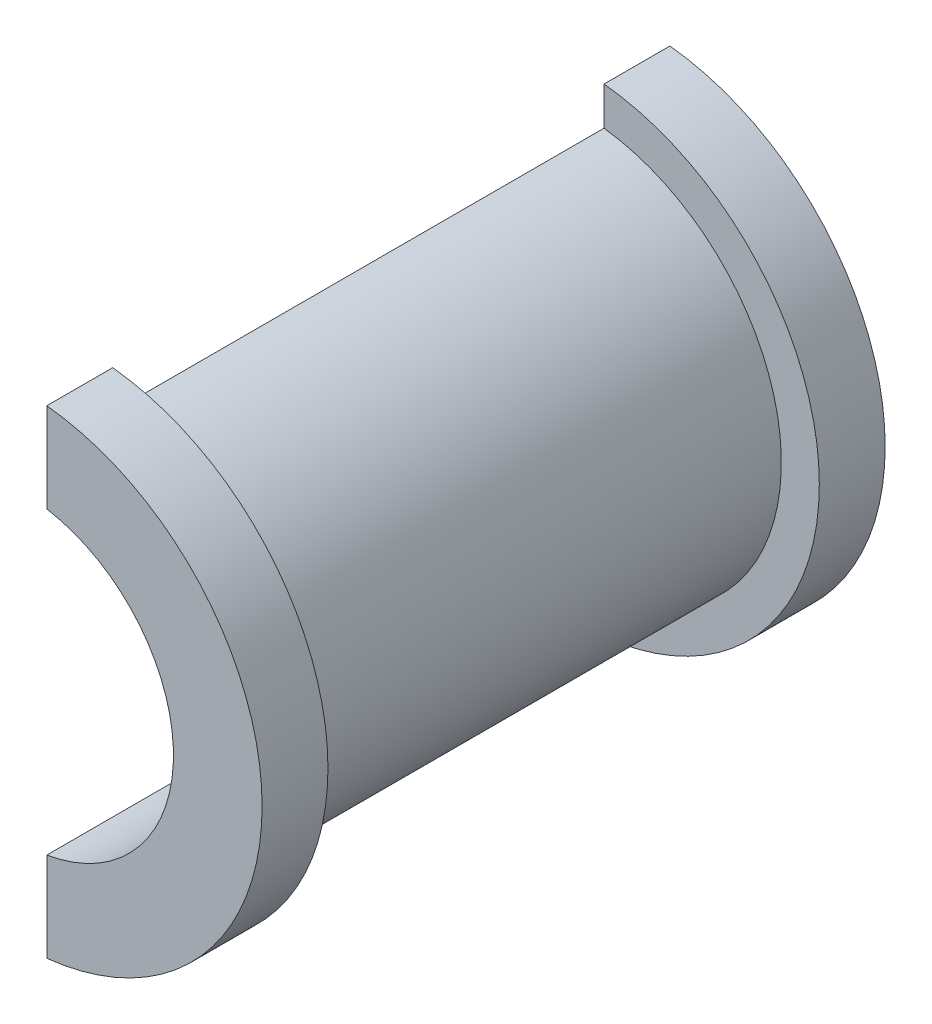
ISO-10303-21;
HEADER;
FILE_DESCRIPTION(('STEP AP214'),'2;1');
FILE_NAME('part.step','',(''),(''),'','','');
FILE_SCHEMA(('AUTOMOTIVE_DESIGN { 1 0 10303 214 1 1 1 1 }'));
ENDSEC;
DATA;
#1=APPLICATION_CONTEXT('core data for automotive mechanical design processes');
#2=APPLICATION_PROTOCOL_DEFINITION('international standard','automotive_design',2000,#1);
#3=PRODUCT_CONTEXT('',#1,'mechanical');
#4=PRODUCT('Part','Part','',(#3));
#5=PRODUCT_RELATED_PRODUCT_CATEGORY('part','',(#4));
#6=PRODUCT_DEFINITION_FORMATION('','',#4);
#7=PRODUCT_DEFINITION_CONTEXT('part definition',#1,'design');
#8=PRODUCT_DEFINITION('design','',#6,#7);
#9=PRODUCT_DEFINITION_SHAPE('','',#8);
#10=(LENGTH_UNIT() NAMED_UNIT(*) SI_UNIT(.MILLI.,.METRE.));
#11=(NAMED_UNIT(*) PLANE_ANGLE_UNIT() SI_UNIT($,.RADIAN.));
#12=(NAMED_UNIT(*) SI_UNIT($,.STERADIAN.) SOLID_ANGLE_UNIT());
#13=UNCERTAINTY_MEASURE_WITH_UNIT(LENGTH_MEASURE(1.E-05),#10,'distance_accuracy_value','');
#14=(GEOMETRIC_REPRESENTATION_CONTEXT(3) GLOBAL_UNCERTAINTY_ASSIGNED_CONTEXT((#13)) GLOBAL_UNIT_ASSIGNED_CONTEXT((#10,
#11,#12)) REPRESENTATION_CONTEXT('',''));
#15=CARTESIAN_POINT('',(0.,0.,0.));
#16=DIRECTION('',(0.,0.,1.));
#17=DIRECTION('',(1.,0.,0.));
#18=AXIS2_PLACEMENT_3D('',#15,#16,#17);
#19=CARTESIAN_POINT('',(0.,0.,55.));
#20=DIRECTION('',(0.,0.,-1.));
#21=DIRECTION('',(-1.,0.,0.));
#22=AXIS2_PLACEMENT_3D('',#19,#20,#21);
#23=CYLINDRICAL_SURFACE('',#22,30.);
#24=DIRECTION('',(0.,0.,-1.));
#25=VECTOR('',#24,1.);
#26=CARTESIAN_POINT('',(5.,29.5803989154981,55.));
#27=LINE('',#26,#25);
#28=CARTESIAN_POINT('',(4.99999999999999,29.5803989154981,61.5));
#29=VERTEX_POINT('',#28);
#30=CARTESIAN_POINT('',(4.99999999999999,29.5803989154981,-61.5));
#31=VERTEX_POINT('',#30);
#32=EDGE_CURVE('E167',#29,#31,#27,.T.);
#33=ORIENTED_EDGE('',*,*,#32,.T.);
#34=CARTESIAN_POINT('',(0.,0.,-61.5));
#35=DIRECTION('',(0.,0.,-1.));
#36=DIRECTION('',(1.,0.,0.));
#37=AXIS2_PLACEMENT_3D('',#34,#35,#36);
#38=CIRCLE('',#37,30.);
#39=CARTESIAN_POINT('',(5.,-29.5803989154981,-61.5));
#40=VERTEX_POINT('',#39);
#41=EDGE_CURVE('E130',#31,#40,#38,.T.);
#42=ORIENTED_EDGE('',*,*,#41,.T.);
#43=DIRECTION('',(0.,0.,-1.));
#44=VECTOR('',#43,1.);
#45=CARTESIAN_POINT('',(5.,-29.5803989154981,55.));
#46=LINE('',#45,#44);
#47=CARTESIAN_POINT('',(5.,-29.5803989154981,61.5));
#48=VERTEX_POINT('',#47);
#49=EDGE_CURVE('E11',#48,#40,#46,.T.);
#50=ORIENTED_EDGE('',*,*,#49,.F.);
#51=CARTESIAN_POINT('',(0.,0.,61.5));
#52=DIRECTION('',(0.,0.,-1.));
#53=DIRECTION('',(1.,0.,0.));
#54=AXIS2_PLACEMENT_3D('',#51,#52,#53);
#55=CIRCLE('',#54,30.);
#56=EDGE_CURVE('E149',#29,#48,#55,.T.);
#57=ORIENTED_EDGE('',*,*,#56,.F.);
#58=EDGE_LOOP('',(#33,#42,#50,#57));
#59=FACE_BOUND('',#58,.T.);
#60=ADVANCED_FACE('F41',(#59),#23,.F.);
#61=CARTESIAN_POINT('',(5.,-29.5803989154981,55.));
#62=DIRECTION('',(1.,0.,0.));
#63=DIRECTION('',(0.,1.,0.));
#64=AXIS2_PLACEMENT_3D('',#61,#62,#63);
#65=PLANE('',#64);
#66=ORIENTED_EDGE('',*,*,#49,.T.);
#67=DIRECTION('',(0.,-1.,0.));
#68=VECTOR('',#67,1.);
#69=CARTESIAN_POINT('',(5.,-29.5803989154981,-61.5));
#70=LINE('',#69,#68);
#71=CARTESIAN_POINT('',(5.,-47.236109069228,-61.5));
#72=VERTEX_POINT('',#71);
#73=EDGE_CURVE('E122',#40,#72,#70,.T.);
#74=ORIENTED_EDGE('',*,*,#73,.T.);
#75=DIRECTION('',(0.,0.,1.));
#76=VECTOR('',#75,1.);
#77=CARTESIAN_POINT('',(5.,-47.236109069228,-61.5));
#78=LINE('',#77,#76);
#79=CARTESIAN_POINT('',(5.,-47.236109069228,-48.5));
#80=VERTEX_POINT('',#79);
#81=EDGE_CURVE('E105',#72,#80,#78,.T.);
#82=ORIENTED_EDGE('',*,*,#81,.T.);
#83=DIRECTION('',(0.,-1.,0.));
#84=VECTOR('',#83,1.);
#85=CARTESIAN_POINT('',(5.,-29.5803989154981,-48.5));
#86=LINE('',#85,#84);
#87=CARTESIAN_POINT('',(5.,-39.6862696659689,-48.5));
#88=VERTEX_POINT('',#87);
#89=EDGE_CURVE('E136',#88,#80,#86,.T.);
#90=ORIENTED_EDGE('',*,*,#89,.F.);
#91=DIRECTION('',(0.,0.,-1.));
#92=VECTOR('',#91,1.);
#93=CARTESIAN_POINT('',(5.00000000000001,-39.6862696659689,55.));
#94=LINE('',#93,#92);
#95=CARTESIAN_POINT('',(5.00000000000001,-39.6862696659689,48.5));
#96=VERTEX_POINT('',#95);
#97=EDGE_CURVE('E48',#96,#88,#94,.T.);
#98=ORIENTED_EDGE('',*,*,#97,.F.);
#99=DIRECTION('',(0.,-1.,0.));
#100=VECTOR('',#99,1.);
#101=CARTESIAN_POINT('',(5.,-29.5803989154981,48.5));
#102=LINE('',#101,#100);
#103=CARTESIAN_POINT('',(5.,-47.236109069228,48.5));
#104=VERTEX_POINT('',#103);
#105=EDGE_CURVE('E146',#96,#104,#102,.T.);
#106=ORIENTED_EDGE('',*,*,#105,.T.);
#107=DIRECTION('',(0.,0.,-1.));
#108=VECTOR('',#107,1.);
#109=CARTESIAN_POINT('',(5.,-47.236109069228,61.5));
#110=LINE('',#109,#108);
#111=CARTESIAN_POINT('',(5.,-47.236109069228,61.5));
#112=VERTEX_POINT('',#111);
#113=EDGE_CURVE('E154',#112,#104,#110,.T.);
#114=ORIENTED_EDGE('',*,*,#113,.F.);
#115=DIRECTION('',(0.,-1.,0.));
#116=VECTOR('',#115,1.);
#117=CARTESIAN_POINT('',(5.,-29.5803989154981,61.5));
#118=LINE('',#117,#116);
#119=EDGE_CURVE('E152',#48,#112,#118,.T.);
#120=ORIENTED_EDGE('',*,*,#119,.F.);
#121=EDGE_LOOP('',(#66,#74,#82,#90,#98,#106,#114,#120));
#122=FACE_BOUND('',#121,.T.);
#123=ADVANCED_FACE('F128',(#122),#65,.F.);
#124=CARTESIAN_POINT('',(0.,0.,55.));
#125=DIRECTION('',(0.,0.,-1.));
#126=DIRECTION('',(-1.,0.,0.));
#127=AXIS2_PLACEMENT_3D('',#124,#125,#126);
#128=CYLINDRICAL_SURFACE('',#127,40.);
#129=ORIENTED_EDGE('',*,*,#97,.T.);
#130=CARTESIAN_POINT('',(0.,0.,-48.5));
#131=DIRECTION('',(0.,0.,1.));
#132=DIRECTION('',(1.,0.,0.));
#133=AXIS2_PLACEMENT_3D('',#130,#131,#132);
#134=CIRCLE('',#133,40.);
#135=CARTESIAN_POINT('',(5.,39.6862696659689,-48.5));
#136=VERTEX_POINT('',#135);
#137=EDGE_CURVE('E115',#88,#136,#134,.T.);
#138=ORIENTED_EDGE('',*,*,#137,.T.);
#139=DIRECTION('',(0.,0.,-1.));
#140=VECTOR('',#139,1.);
#141=CARTESIAN_POINT('',(5.,39.6862696659689,55.));
#142=LINE('',#141,#140);
#143=CARTESIAN_POINT('',(5.,39.6862696659689,48.5));
#144=VERTEX_POINT('',#143);
#145=EDGE_CURVE('E60',#144,#136,#142,.T.);
#146=ORIENTED_EDGE('',*,*,#145,.F.);
#147=CARTESIAN_POINT('',(0.,0.,48.5));
#148=DIRECTION('',(0.,0.,-1.));
#149=DIRECTION('',(-1.,0.,0.));
#150=AXIS2_PLACEMENT_3D('',#147,#148,#149);
#151=CIRCLE('',#150,40.);
#152=EDGE_CURVE('E55',#144,#96,#151,.T.);
#153=ORIENTED_EDGE('',*,*,#152,.T.);
#154=EDGE_LOOP('',(#129,#138,#146,#153));
#155=FACE_BOUND('',#154,.T.);
#156=ADVANCED_FACE('F169',(#155),#128,.T.);
#157=CARTESIAN_POINT('',(5.,29.5803989154981,55.));
#158=DIRECTION('',(1.,0.,0.));
#159=DIRECTION('',(0.,0.,-1.));
#160=AXIS2_PLACEMENT_3D('',#157,#158,#159);
#161=PLANE('',#160);
#162=ORIENTED_EDGE('',*,*,#145,.T.);
#163=DIRECTION('',(0.,-1.,0.));
#164=VECTOR('',#163,1.);
#165=CARTESIAN_POINT('',(5.,29.5803989154981,-48.5));
#166=LINE('',#165,#164);
#167=CARTESIAN_POINT('',(5.,47.236109069228,-48.5));
#168=VERTEX_POINT('',#167);
#169=EDGE_CURVE('E126',#168,#136,#166,.T.);
#170=ORIENTED_EDGE('',*,*,#169,.F.);
#171=DIRECTION('',(0.,0.,1.));
#172=VECTOR('',#171,1.);
#173=CARTESIAN_POINT('',(5.,47.236109069228,-61.5));
#174=LINE('',#173,#172);
#175=CARTESIAN_POINT('',(5.,47.236109069228,-61.5));
#176=VERTEX_POINT('',#175);
#177=EDGE_CURVE('E116',#176,#168,#174,.T.);
#178=ORIENTED_EDGE('',*,*,#177,.F.);
#179=DIRECTION('',(0.,-1.,0.));
#180=VECTOR('',#179,1.);
#181=CARTESIAN_POINT('',(5.,29.5803989154981,-61.5));
#182=LINE('',#181,#180);
#183=EDGE_CURVE('E125',#176,#31,#182,.T.);
#184=ORIENTED_EDGE('',*,*,#183,.T.);
#185=ORIENTED_EDGE('',*,*,#32,.F.);
#186=DIRECTION('',(0.,-1.,0.));
#187=VECTOR('',#186,1.);
#188=CARTESIAN_POINT('',(5.,29.5803989154981,61.5));
#189=LINE('',#188,#187);
#190=CARTESIAN_POINT('',(5.,47.236109069228,61.5));
#191=VERTEX_POINT('',#190);
#192=EDGE_CURVE('E145',#191,#29,#189,.T.);
#193=ORIENTED_EDGE('',*,*,#192,.F.);
#194=DIRECTION('',(0.,0.,-1.));
#195=VECTOR('',#194,1.);
#196=CARTESIAN_POINT('',(5.,47.236109069228,61.5));
#197=LINE('',#196,#195);
#198=CARTESIAN_POINT('',(5.,47.236109069228,48.5));
#199=VERTEX_POINT('',#198);
#200=EDGE_CURVE('E163',#191,#199,#197,.T.);
#201=ORIENTED_EDGE('',*,*,#200,.T.);
#202=DIRECTION('',(0.,-1.,0.));
#203=VECTOR('',#202,1.);
#204=CARTESIAN_POINT('',(5.,29.5803989154981,48.5));
#205=LINE('',#204,#203);
#206=EDGE_CURVE('E157',#199,#144,#205,.T.);
#207=ORIENTED_EDGE('',*,*,#206,.T.);
#208=EDGE_LOOP('',(#162,#170,#178,#184,#185,#193,#201,#207));
#209=FACE_BOUND('',#208,.T.);
#210=ADVANCED_FACE('F184',(#209),#161,.F.);
#211=CARTESIAN_POINT('',(0.,0.,48.5));
#212=DIRECTION('',(0.,0.,-1.));
#213=DIRECTION('',(-1.,0.,0.));
#214=AXIS2_PLACEMENT_3D('',#211,#212,#213);
#215=PLANE('',#214);
#216=ORIENTED_EDGE('',*,*,#152,.F.);
#217=ORIENTED_EDGE('',*,*,#206,.F.);
#218=CARTESIAN_POINT('',(0.,0.,48.5));
#219=DIRECTION('',(0.,0.,1.));
#220=DIRECTION('',(-1.,0.,0.));
#221=AXIS2_PLACEMENT_3D('',#218,#219,#220);
#222=CIRCLE('',#221,47.5);
#223=EDGE_CURVE('E141',#104,#199,#222,.T.);
#224=ORIENTED_EDGE('',*,*,#223,.F.);
#225=ORIENTED_EDGE('',*,*,#105,.F.);
#226=EDGE_LOOP('',(#216,#217,#224,#225));
#227=FACE_BOUND('',#226,.T.);
#228=ADVANCED_FACE('F174',(#227),#215,.T.);
#229=CARTESIAN_POINT('',(0.,0.,61.5));
#230=DIRECTION('',(0.,0.,-1.));
#231=DIRECTION('',(-1.,0.,0.));
#232=AXIS2_PLACEMENT_3D('',#229,#230,#231);
#233=CYLINDRICAL_SURFACE('',#232,47.5);
#234=ORIENTED_EDGE('',*,*,#223,.T.);
#235=ORIENTED_EDGE('',*,*,#200,.F.);
#236=CARTESIAN_POINT('',(0.,0.,61.5));
#237=DIRECTION('',(0.,0.,1.));
#238=DIRECTION('',(-1.,0.,0.));
#239=AXIS2_PLACEMENT_3D('',#236,#237,#238);
#240=CIRCLE('',#239,47.5);
#241=EDGE_CURVE('E142',#112,#191,#240,.T.);
#242=ORIENTED_EDGE('',*,*,#241,.F.);
#243=ORIENTED_EDGE('',*,*,#113,.T.);
#244=EDGE_LOOP('',(#234,#235,#242,#243));
#245=FACE_BOUND('',#244,.T.);
#246=ADVANCED_FACE('F177',(#245),#233,.T.);
#247=CARTESIAN_POINT('',(0.,0.,61.5));
#248=DIRECTION('',(0.,0.,-1.));
#249=DIRECTION('',(-1.,0.,0.));
#250=AXIS2_PLACEMENT_3D('',#247,#248,#249);
#251=PLANE('',#250);
#252=ORIENTED_EDGE('',*,*,#241,.T.);
#253=ORIENTED_EDGE('',*,*,#192,.T.);
#254=ORIENTED_EDGE('',*,*,#56,.T.);
#255=ORIENTED_EDGE('',*,*,#119,.T.);
#256=EDGE_LOOP('',(#252,#253,#254,#255));
#257=FACE_BOUND('',#256,.T.);
#258=ADVANCED_FACE('F180',(#257),#251,.F.);
#259=CARTESIAN_POINT('',(0.,0.,-48.5));
#260=DIRECTION('',(0.,0.,1.));
#261=DIRECTION('',(-1.,0.,0.));
#262=AXIS2_PLACEMENT_3D('',#259,#260,#261);
#263=PLANE('',#262);
#264=ORIENTED_EDGE('',*,*,#137,.F.);
#265=ORIENTED_EDGE('',*,*,#89,.T.);
#266=CARTESIAN_POINT('',(0.,0.,-48.5));
#267=DIRECTION('',(0.,0.,1.));
#268=DIRECTION('',(-1.,0.,0.));
#269=AXIS2_PLACEMENT_3D('',#266,#267,#268);
#270=CIRCLE('',#269,47.5);
#271=EDGE_CURVE('E111',#80,#168,#270,.T.);
#272=ORIENTED_EDGE('',*,*,#271,.T.);
#273=ORIENTED_EDGE('',*,*,#169,.T.);
#274=EDGE_LOOP('',(#264,#265,#272,#273));
#275=FACE_BOUND('',#274,.T.);
#276=ADVANCED_FACE('F187',(#275),#263,.T.);
#277=CARTESIAN_POINT('',(0.,0.,-61.5));
#278=DIRECTION('',(0.,0.,1.));
#279=DIRECTION('',(1.,0.,0.));
#280=AXIS2_PLACEMENT_3D('',#277,#278,#279);
#281=CYLINDRICAL_SURFACE('',#280,47.5);
#282=ORIENTED_EDGE('',*,*,#271,.F.);
#283=ORIENTED_EDGE('',*,*,#81,.F.);
#284=CARTESIAN_POINT('',(0.,0.,-61.5));
#285=DIRECTION('',(0.,0.,1.));
#286=DIRECTION('',(-1.,0.,0.));
#287=AXIS2_PLACEMENT_3D('',#284,#285,#286);
#288=CIRCLE('',#287,47.5);
#289=EDGE_CURVE('E108',#72,#176,#288,.T.);
#290=ORIENTED_EDGE('',*,*,#289,.T.);
#291=ORIENTED_EDGE('',*,*,#177,.T.);
#292=EDGE_LOOP('',(#282,#283,#290,#291));
#293=FACE_BOUND('',#292,.T.);
#294=ADVANCED_FACE('F107',(#293),#281,.T.);
#295=CARTESIAN_POINT('',(0.,0.,-61.5));
#296=DIRECTION('',(0.,0.,1.));
#297=DIRECTION('',(-1.,0.,0.));
#298=AXIS2_PLACEMENT_3D('',#295,#296,#297);
#299=PLANE('',#298);
#300=ORIENTED_EDGE('',*,*,#289,.F.);
#301=ORIENTED_EDGE('',*,*,#73,.F.);
#302=ORIENTED_EDGE('',*,*,#41,.F.);
#303=ORIENTED_EDGE('',*,*,#183,.F.);
#304=EDGE_LOOP('',(#300,#301,#302,#303));
#305=FACE_BOUND('',#304,.T.);
#306=ADVANCED_FACE('F120',(#305),#299,.F.);
#307=CLOSED_SHELL('',(#60,#123,#156,#210,#228,#246,#258,#276,#294,#306));
#308=MANIFOLD_SOLID_BREP('B2',#307);
#309=ADVANCED_BREP_SHAPE_REPRESENTATION('',(#18,#308),#14);
#310=SHAPE_DEFINITION_REPRESENTATION(#9,#309);
ENDSEC;
END-ISO-10303-21;
